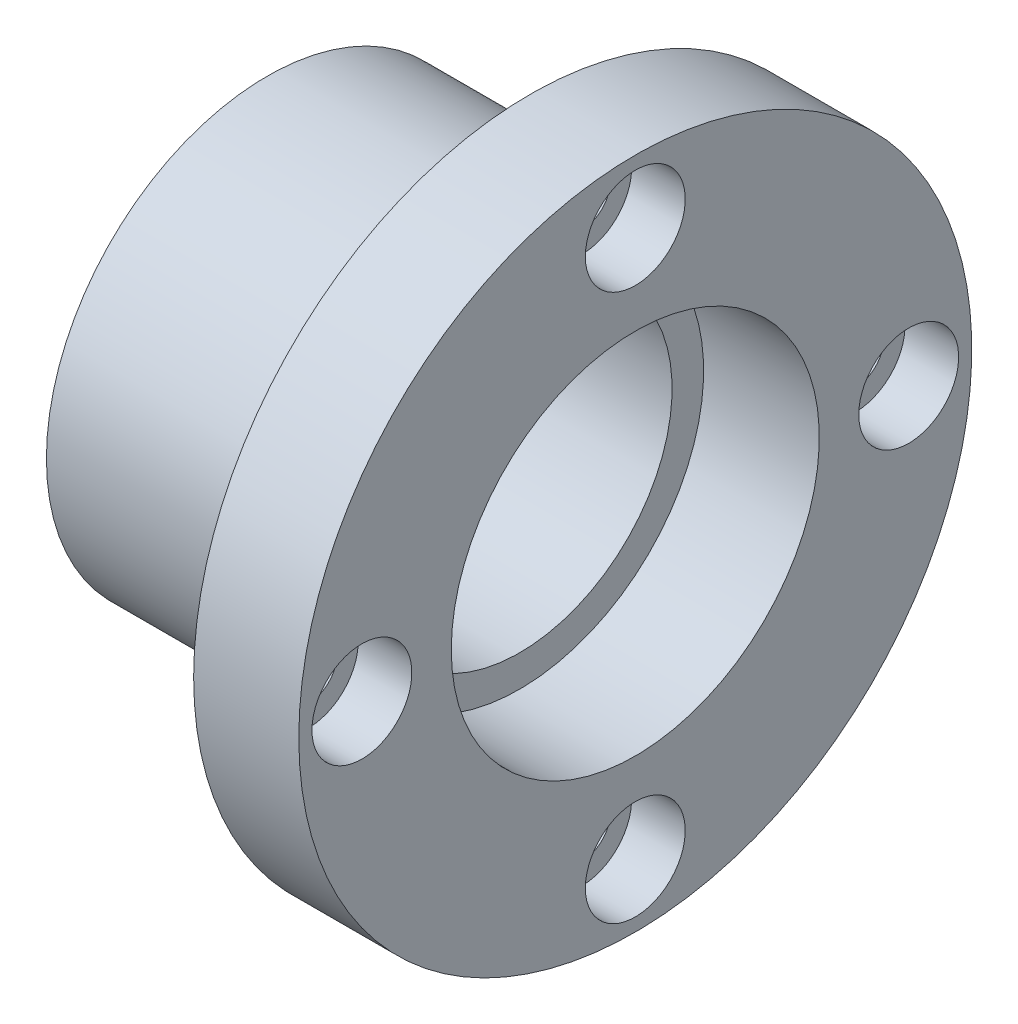
ISO-10303-21;
HEADER;
FILE_DESCRIPTION(('STEP AP214'),'2;1');
FILE_NAME('part.step','',(''),(''),'','','');
FILE_SCHEMA(('AUTOMOTIVE_DESIGN { 1 0 10303 214 1 1 1 1 }'));
ENDSEC;
DATA;
#1=APPLICATION_CONTEXT('core data for automotive mechanical design processes');
#2=APPLICATION_PROTOCOL_DEFINITION('international standard','automotive_design',2000,#1);
#3=PRODUCT_CONTEXT('',#1,'mechanical');
#4=PRODUCT('Part','Part','',(#3));
#5=PRODUCT_RELATED_PRODUCT_CATEGORY('part','',(#4));
#6=PRODUCT_DEFINITION_FORMATION('','',#4);
#7=PRODUCT_DEFINITION_CONTEXT('part definition',#1,'design');
#8=PRODUCT_DEFINITION('design','',#6,#7);
#9=PRODUCT_DEFINITION_SHAPE('','',#8);
#10=(LENGTH_UNIT() NAMED_UNIT(*) SI_UNIT(.MILLI.,.METRE.));
#11=(NAMED_UNIT(*) PLANE_ANGLE_UNIT() SI_UNIT($,.RADIAN.));
#12=(NAMED_UNIT(*) SI_UNIT($,.STERADIAN.) SOLID_ANGLE_UNIT());
#13=UNCERTAINTY_MEASURE_WITH_UNIT(LENGTH_MEASURE(1.E-05),#10,'distance_accuracy_value','');
#14=(GEOMETRIC_REPRESENTATION_CONTEXT(3) GLOBAL_UNCERTAINTY_ASSIGNED_CONTEXT((#13)) GLOBAL_UNIT_ASSIGNED_CONTEXT((#10,
#11,#12)) REPRESENTATION_CONTEXT('',''));
#15=CARTESIAN_POINT('',(0.,0.,0.));
#16=DIRECTION('',(0.,0.,1.));
#17=DIRECTION('',(1.,0.,0.));
#18=AXIS2_PLACEMENT_3D('',#15,#16,#17);
#19=CARTESIAN_POINT('',(0.,17.5,0.));
#20=DIRECTION('',(-1.,0.,0.));
#21=DIRECTION('',(0.,0.,1.));
#22=AXIS2_PLACEMENT_3D('',#19,#20,#21);
#23=PLANE('',#22);
#24=CARTESIAN_POINT('',(0.,0.,26.));
#25=DIRECTION('',(-1.,0.,0.));
#26=DIRECTION('',(0.,0.,1.));
#27=AXIS2_PLACEMENT_3D('',#24,#25,#26);
#28=CIRCLE('',#27,4.75);
#29=CARTESIAN_POINT('',(0.,0.,30.75));
#30=VERTEX_POINT('',#29);
#31=EDGE_CURVE('E108',#30,#30,#28,.T.);
#32=ORIENTED_EDGE('',*,*,#31,.T.);
#33=EDGE_LOOP('',(#32));
#34=FACE_BOUND('',#33,.T.);
#35=CARTESIAN_POINT('',(0.,26.,0.));
#36=DIRECTION('',(-1.,0.,0.));
#37=DIRECTION('',(0.,0.,1.));
#38=AXIS2_PLACEMENT_3D('',#35,#36,#37);
#39=CIRCLE('',#38,4.75);
#40=CARTESIAN_POINT('',(0.,26.,4.75));
#41=VERTEX_POINT('',#40);
#42=EDGE_CURVE('E84',#41,#41,#39,.T.);
#43=ORIENTED_EDGE('',*,*,#42,.T.);
#44=EDGE_LOOP('',(#43));
#45=FACE_BOUND('',#44,.T.);
#46=CARTESIAN_POINT('',(0.,0.,0.));
#47=DIRECTION('',(-1.,0.,0.));
#48=DIRECTION('',(0.,0.,1.));
#49=AXIS2_PLACEMENT_3D('',#46,#47,#48);
#50=CIRCLE('',#49,32.);
#51=CARTESIAN_POINT('',(0.,0.,32.));
#52=VERTEX_POINT('',#51);
#53=EDGE_CURVE('E66',#52,#52,#50,.T.);
#54=ORIENTED_EDGE('',*,*,#53,.F.);
#55=EDGE_LOOP('',(#54));
#56=FACE_BOUND('',#55,.T.);
#57=CARTESIAN_POINT('',(0.,0.,0.));
#58=DIRECTION('',(-1.,0.,0.));
#59=DIRECTION('',(0.,0.,1.));
#60=AXIS2_PLACEMENT_3D('',#57,#58,#59);
#61=CIRCLE('',#60,17.5);
#62=CARTESIAN_POINT('',(0.,0.,17.5));
#63=VERTEX_POINT('',#62);
#64=EDGE_CURVE('E63',#63,#63,#61,.T.);
#65=ORIENTED_EDGE('',*,*,#64,.T.);
#66=EDGE_LOOP('',(#65));
#67=FACE_BOUND('',#66,.T.);
#68=CARTESIAN_POINT('',(0.,0.,-26.));
#69=DIRECTION('',(-1.,0.,0.));
#70=DIRECTION('',(0.,0.,1.));
#71=AXIS2_PLACEMENT_3D('',#68,#69,#70);
#72=CIRCLE('',#71,4.75);
#73=CARTESIAN_POINT('',(0.,0.,-21.25));
#74=VERTEX_POINT('',#73);
#75=EDGE_CURVE('E96',#74,#74,#72,.T.);
#76=ORIENTED_EDGE('',*,*,#75,.T.);
#77=EDGE_LOOP('',(#76));
#78=FACE_BOUND('',#77,.T.);
#79=CARTESIAN_POINT('',(0.,-26.,0.));
#80=DIRECTION('',(-1.,0.,0.));
#81=DIRECTION('',(0.,0.,1.));
#82=AXIS2_PLACEMENT_3D('',#79,#80,#81);
#83=CIRCLE('',#82,4.75);
#84=CARTESIAN_POINT('',(0.,-26.,4.75));
#85=VERTEX_POINT('',#84);
#86=EDGE_CURVE('E120',#85,#85,#83,.T.);
#87=ORIENTED_EDGE('',*,*,#86,.T.);
#88=EDGE_LOOP('',(#87));
#89=FACE_BOUND('',#88,.T.);
#90=ADVANCED_FACE('F37',(#34,#45,#56,#67,#78,#89),#23,.F.);
#91=CARTESIAN_POINT('',(-10.,32.,0.));
#92=DIRECTION('',(1.,0.,0.));
#93=DIRECTION('',(0.,0.,-1.));
#94=AXIS2_PLACEMENT_3D('',#91,#92,#93);
#95=PLANE('',#94);
#96=CARTESIAN_POINT('',(-10.,0.,26.));
#97=DIRECTION('',(-1.,0.,0.));
#98=DIRECTION('',(0.,0.,1.));
#99=AXIS2_PLACEMENT_3D('',#96,#97,#98);
#100=CIRCLE('',#99,2.75);
#101=CARTESIAN_POINT('',(-10.,0.,28.75));
#102=VERTEX_POINT('',#101);
#103=EDGE_CURVE('E99',#102,#102,#100,.T.);
#104=ORIENTED_EDGE('',*,*,#103,.F.);
#105=EDGE_LOOP('',(#104));
#106=FACE_BOUND('',#105,.T.);
#107=CARTESIAN_POINT('',(-10.,26.,0.));
#108=DIRECTION('',(-1.,0.,0.));
#109=DIRECTION('',(0.,0.,1.));
#110=AXIS2_PLACEMENT_3D('',#107,#108,#109);
#111=CIRCLE('',#110,2.75);
#112=CARTESIAN_POINT('',(-10.,26.,2.75));
#113=VERTEX_POINT('',#112);
#114=EDGE_CURVE('E75',#113,#113,#111,.T.);
#115=ORIENTED_EDGE('',*,*,#114,.F.);
#116=EDGE_LOOP('',(#115));
#117=FACE_BOUND('',#116,.T.);
#118=CARTESIAN_POINT('',(-10.,0.,0.));
#119=DIRECTION('',(-1.,0.,0.));
#120=DIRECTION('',(0.,0.,1.));
#121=AXIS2_PLACEMENT_3D('',#118,#119,#120);
#122=CIRCLE('',#121,21.);
#123=CARTESIAN_POINT('',(-10.,0.,21.));
#124=VERTEX_POINT('',#123);
#125=EDGE_CURVE('E72',#124,#124,#122,.T.);
#126=ORIENTED_EDGE('',*,*,#125,.F.);
#127=EDGE_LOOP('',(#126));
#128=FACE_BOUND('',#127,.T.);
#129=CARTESIAN_POINT('',(-10.,0.,0.));
#130=DIRECTION('',(-1.,0.,0.));
#131=DIRECTION('',(0.,0.,1.));
#132=AXIS2_PLACEMENT_3D('',#129,#130,#131);
#133=CIRCLE('',#132,32.);
#134=CARTESIAN_POINT('',(-10.,0.,32.));
#135=VERTEX_POINT('',#134);
#136=EDGE_CURVE('E69',#135,#135,#133,.T.);
#137=ORIENTED_EDGE('',*,*,#136,.T.);
#138=EDGE_LOOP('',(#137));
#139=FACE_BOUND('',#138,.T.);
#140=CARTESIAN_POINT('',(-10.,0.,-26.));
#141=DIRECTION('',(-1.,0.,0.));
#142=DIRECTION('',(0.,0.,1.));
#143=AXIS2_PLACEMENT_3D('',#140,#141,#142);
#144=CIRCLE('',#143,2.75);
#145=CARTESIAN_POINT('',(-10.,0.,-23.25));
#146=VERTEX_POINT('',#145);
#147=EDGE_CURVE('E87',#146,#146,#144,.T.);
#148=ORIENTED_EDGE('',*,*,#147,.F.);
#149=EDGE_LOOP('',(#148));
#150=FACE_BOUND('',#149,.T.);
#151=CARTESIAN_POINT('',(-10.,-26.,0.));
#152=DIRECTION('',(-1.,0.,0.));
#153=DIRECTION('',(0.,0.,1.));
#154=AXIS2_PLACEMENT_3D('',#151,#152,#153);
#155=CIRCLE('',#154,2.75);
#156=CARTESIAN_POINT('',(-10.,-26.,2.75));
#157=VERTEX_POINT('',#156);
#158=EDGE_CURVE('E111',#157,#157,#155,.T.);
#159=ORIENTED_EDGE('',*,*,#158,.F.);
#160=EDGE_LOOP('',(#159));
#161=FACE_BOUND('',#160,.T.);
#162=ADVANCED_FACE('F137',(#106,#117,#128,#139,#150,#161),#95,.F.);
#163=CARTESIAN_POINT('',(0.,0.,0.));
#164=DIRECTION('',(-1.,0.,0.));
#165=DIRECTION('',(0.,0.,1.));
#166=AXIS2_PLACEMENT_3D('',#163,#164,#165);
#167=CYLINDRICAL_SURFACE('',#166,21.);
#168=CARTESIAN_POINT('',(-35.,0.,0.));
#169=DIRECTION('',(-1.,0.,0.));
#170=DIRECTION('',(0.,0.,1.));
#171=AXIS2_PLACEMENT_3D('',#168,#169,#170);
#172=CIRCLE('',#171,21.);
#173=CARTESIAN_POINT('',(-35.,0.,21.));
#174=VERTEX_POINT('',#173);
#175=EDGE_CURVE('E10',#174,#174,#172,.T.);
#176=ORIENTED_EDGE('',*,*,#175,.F.);
#177=EDGE_LOOP('',(#176));
#178=FACE_BOUND('',#177,.T.);
#179=ORIENTED_EDGE('',*,*,#125,.T.);
#180=EDGE_LOOP('',(#179));
#181=FACE_BOUND('',#180,.T.);
#182=ADVANCED_FACE('F39',(#178,#181),#167,.T.);
#183=CARTESIAN_POINT('',(-35.,21.,0.));
#184=DIRECTION('',(1.,0.,0.));
#185=DIRECTION('',(0.,0.,-1.));
#186=AXIS2_PLACEMENT_3D('',#183,#184,#185);
#187=PLANE('',#186);
#188=CARTESIAN_POINT('',(-35.,0.,0.));
#189=DIRECTION('',(-1.,0.,0.));
#190=DIRECTION('',(0.,0.,1.));
#191=AXIS2_PLACEMENT_3D('',#188,#189,#190);
#192=CIRCLE('',#191,17.5);
#193=CARTESIAN_POINT('',(-35.,0.,17.5));
#194=VERTEX_POINT('',#193);
#195=EDGE_CURVE('E44',#194,#194,#192,.T.);
#196=ORIENTED_EDGE('',*,*,#195,.F.);
#197=EDGE_LOOP('',(#196));
#198=FACE_BOUND('',#197,.T.);
#199=ORIENTED_EDGE('',*,*,#175,.T.);
#200=EDGE_LOOP('',(#199));
#201=FACE_BOUND('',#200,.T.);
#202=ADVANCED_FACE('F167',(#198,#201),#187,.F.);
#203=CARTESIAN_POINT('',(0.,0.,0.));
#204=DIRECTION('',(-1.,0.,0.));
#205=DIRECTION('',(0.,0.,1.));
#206=AXIS2_PLACEMENT_3D('',#203,#204,#205);
#207=CYLINDRICAL_SURFACE('',#206,17.5);
#208=CARTESIAN_POINT('',(-24.,0.,0.));
#209=DIRECTION('',(-1.,0.,0.));
#210=DIRECTION('',(0.,0.,1.));
#211=AXIS2_PLACEMENT_3D('',#208,#209,#210);
#212=CIRCLE('',#211,17.5);
#213=CARTESIAN_POINT('',(-24.,0.,17.5));
#214=VERTEX_POINT('',#213);
#215=EDGE_CURVE('E48',#214,#214,#212,.T.);
#216=ORIENTED_EDGE('',*,*,#215,.F.);
#217=EDGE_LOOP('',(#216));
#218=FACE_BOUND('',#217,.T.);
#219=ORIENTED_EDGE('',*,*,#195,.T.);
#220=EDGE_LOOP('',(#219));
#221=FACE_BOUND('',#220,.T.);
#222=ADVANCED_FACE('F164',(#218,#221),#207,.F.);
#223=CARTESIAN_POINT('',(-24.,17.5,0.));
#224=DIRECTION('',(1.,0.,0.));
#225=DIRECTION('',(0.,0.,-1.));
#226=AXIS2_PLACEMENT_3D('',#223,#224,#225);
#227=PLANE('',#226);
#228=CARTESIAN_POINT('',(-24.,0.,0.));
#229=DIRECTION('',(-1.,0.,0.));
#230=DIRECTION('',(0.,0.,1.));
#231=AXIS2_PLACEMENT_3D('',#228,#229,#230);
#232=CIRCLE('',#231,14.5);
#233=CARTESIAN_POINT('',(-24.,0.,14.5));
#234=VERTEX_POINT('',#233);
#235=EDGE_CURVE('E52',#234,#234,#232,.T.);
#236=ORIENTED_EDGE('',*,*,#235,.F.);
#237=EDGE_LOOP('',(#236));
#238=FACE_BOUND('',#237,.T.);
#239=ORIENTED_EDGE('',*,*,#215,.T.);
#240=EDGE_LOOP('',(#239));
#241=FACE_BOUND('',#240,.T.);
#242=ADVANCED_FACE('F160',(#238,#241),#227,.F.);
#243=CARTESIAN_POINT('',(0.,0.,0.));
#244=DIRECTION('',(-1.,0.,0.));
#245=DIRECTION('',(0.,0.,1.));
#246=AXIS2_PLACEMENT_3D('',#243,#244,#245);
#247=CYLINDRICAL_SURFACE('',#246,14.5);
#248=CARTESIAN_POINT('',(-11.,0.,0.));
#249=DIRECTION('',(-1.,0.,0.));
#250=DIRECTION('',(0.,0.,1.));
#251=AXIS2_PLACEMENT_3D('',#248,#249,#250);
#252=CIRCLE('',#251,14.5);
#253=CARTESIAN_POINT('',(-11.,0.,14.5));
#254=VERTEX_POINT('',#253);
#255=EDGE_CURVE('E57',#254,#254,#252,.T.);
#256=ORIENTED_EDGE('',*,*,#255,.F.);
#257=EDGE_LOOP('',(#256));
#258=FACE_BOUND('',#257,.T.);
#259=ORIENTED_EDGE('',*,*,#235,.T.);
#260=EDGE_LOOP('',(#259));
#261=FACE_BOUND('',#260,.T.);
#262=ADVANCED_FACE('F156',(#258,#261),#247,.F.);
#263=CARTESIAN_POINT('',(-11.,14.5,0.));
#264=DIRECTION('',(-1.,0.,0.));
#265=DIRECTION('',(0.,0.,1.));
#266=AXIS2_PLACEMENT_3D('',#263,#264,#265);
#267=PLANE('',#266);
#268=CARTESIAN_POINT('',(-11.,0.,0.));
#269=DIRECTION('',(-1.,0.,0.));
#270=DIRECTION('',(0.,0.,1.));
#271=AXIS2_PLACEMENT_3D('',#268,#269,#270);
#272=CIRCLE('',#271,17.5);
#273=CARTESIAN_POINT('',(-11.,0.,17.5));
#274=VERTEX_POINT('',#273);
#275=EDGE_CURVE('E60',#274,#274,#272,.T.);
#276=ORIENTED_EDGE('',*,*,#275,.F.);
#277=EDGE_LOOP('',(#276));
#278=FACE_BOUND('',#277,.T.);
#279=ORIENTED_EDGE('',*,*,#255,.T.);
#280=EDGE_LOOP('',(#279));
#281=FACE_BOUND('',#280,.T.);
#282=ADVANCED_FACE('F152',(#278,#281),#267,.F.);
#283=CARTESIAN_POINT('',(0.,0.,0.));
#284=DIRECTION('',(-1.,0.,0.));
#285=DIRECTION('',(0.,0.,1.));
#286=AXIS2_PLACEMENT_3D('',#283,#284,#285);
#287=CYLINDRICAL_SURFACE('',#286,17.5);
#288=ORIENTED_EDGE('',*,*,#64,.F.);
#289=EDGE_LOOP('',(#288));
#290=FACE_BOUND('',#289,.T.);
#291=ORIENTED_EDGE('',*,*,#275,.T.);
#292=EDGE_LOOP('',(#291));
#293=FACE_BOUND('',#292,.T.);
#294=ADVANCED_FACE('F149',(#290,#293),#287,.F.);
#295=CARTESIAN_POINT('',(0.,0.,0.));
#296=DIRECTION('',(-1.,0.,0.));
#297=DIRECTION('',(0.,0.,1.));
#298=AXIS2_PLACEMENT_3D('',#295,#296,#297);
#299=CYLINDRICAL_SURFACE('',#298,32.);
#300=ORIENTED_EDGE('',*,*,#136,.F.);
#301=EDGE_LOOP('',(#300));
#302=FACE_BOUND('',#301,.T.);
#303=ORIENTED_EDGE('',*,*,#53,.T.);
#304=EDGE_LOOP('',(#303));
#305=FACE_BOUND('',#304,.T.);
#306=ADVANCED_FACE('F148',(#302,#305),#299,.T.);
#307=CARTESIAN_POINT('',(0.,26.,0.));
#308=DIRECTION('',(-1.,0.,0.));
#309=DIRECTION('',(0.,0.,1.));
#310=AXIS2_PLACEMENT_3D('',#307,#308,#309);
#311=CYLINDRICAL_SURFACE('',#310,2.75);
#312=ORIENTED_EDGE('',*,*,#114,.T.);
#313=EDGE_LOOP('',(#312));
#314=FACE_BOUND('',#313,.T.);
#315=CARTESIAN_POINT('',(-5.1,26.,0.));
#316=DIRECTION('',(-1.,0.,0.));
#317=DIRECTION('',(0.,0.,1.));
#318=AXIS2_PLACEMENT_3D('',#315,#316,#317);
#319=CIRCLE('',#318,2.75);
#320=CARTESIAN_POINT('',(-5.1,26.,2.75));
#321=VERTEX_POINT('',#320);
#322=EDGE_CURVE('E78',#321,#321,#319,.T.);
#323=ORIENTED_EDGE('',*,*,#322,.F.);
#324=EDGE_LOOP('',(#323));
#325=FACE_BOUND('',#324,.T.);
#326=ADVANCED_FACE('F227',(#314,#325),#311,.F.);
#327=CARTESIAN_POINT('',(-5.1,28.75,0.));
#328=DIRECTION('',(1.,0.,0.));
#329=DIRECTION('',(0.,0.,-1.));
#330=AXIS2_PLACEMENT_3D('',#327,#328,#329);
#331=PLANE('',#330);
#332=ORIENTED_EDGE('',*,*,#322,.T.);
#333=EDGE_LOOP('',(#332));
#334=FACE_BOUND('',#333,.T.);
#335=CARTESIAN_POINT('',(-5.1,26.,0.));
#336=DIRECTION('',(-1.,0.,0.));
#337=DIRECTION('',(0.,0.,1.));
#338=AXIS2_PLACEMENT_3D('',#335,#336,#337);
#339=CIRCLE('',#338,4.75);
#340=CARTESIAN_POINT('',(-5.1,26.,4.75));
#341=VERTEX_POINT('',#340);
#342=EDGE_CURVE('E81',#341,#341,#339,.T.);
#343=ORIENTED_EDGE('',*,*,#342,.F.);
#344=EDGE_LOOP('',(#343));
#345=FACE_BOUND('',#344,.T.);
#346=ADVANCED_FACE('F223',(#334,#345),#331,.T.);
#347=CARTESIAN_POINT('',(0.,26.,0.));
#348=DIRECTION('',(-1.,0.,0.));
#349=DIRECTION('',(0.,0.,1.));
#350=AXIS2_PLACEMENT_3D('',#347,#348,#349);
#351=CYLINDRICAL_SURFACE('',#350,4.75);
#352=ORIENTED_EDGE('',*,*,#342,.T.);
#353=EDGE_LOOP('',(#352));
#354=FACE_BOUND('',#353,.T.);
#355=ORIENTED_EDGE('',*,*,#42,.F.);
#356=EDGE_LOOP('',(#355));
#357=FACE_BOUND('',#356,.T.);
#358=ADVANCED_FACE('F219',(#354,#357),#351,.F.);
#359=CARTESIAN_POINT('',(0.,0.,-26.));
#360=DIRECTION('',(-1.,0.,0.));
#361=DIRECTION('',(0.,0.,1.));
#362=AXIS2_PLACEMENT_3D('',#359,#360,#361);
#363=CYLINDRICAL_SURFACE('',#362,2.75);
#364=ORIENTED_EDGE('',*,*,#147,.T.);
#365=EDGE_LOOP('',(#364));
#366=FACE_BOUND('',#365,.T.);
#367=CARTESIAN_POINT('',(-5.1,0.,-26.));
#368=DIRECTION('',(-1.,0.,0.));
#369=DIRECTION('',(0.,0.,1.));
#370=AXIS2_PLACEMENT_3D('',#367,#368,#369);
#371=CIRCLE('',#370,2.75);
#372=CARTESIAN_POINT('',(-5.1,0.,-23.25));
#373=VERTEX_POINT('',#372);
#374=EDGE_CURVE('E90',#373,#373,#371,.T.);
#375=ORIENTED_EDGE('',*,*,#374,.F.);
#376=EDGE_LOOP('',(#375));
#377=FACE_BOUND('',#376,.T.);
#378=ADVANCED_FACE('F215',(#366,#377),#363,.F.);
#379=CARTESIAN_POINT('',(-5.1,2.74999999999998,-26.));
#380=DIRECTION('',(1.,0.,0.));
#381=DIRECTION('',(0.,0.,-1.));
#382=AXIS2_PLACEMENT_3D('',#379,#380,#381);
#383=PLANE('',#382);
#384=ORIENTED_EDGE('',*,*,#374,.T.);
#385=EDGE_LOOP('',(#384));
#386=FACE_BOUND('',#385,.T.);
#387=CARTESIAN_POINT('',(-5.1,0.,-26.));
#388=DIRECTION('',(-1.,0.,0.));
#389=DIRECTION('',(0.,0.,1.));
#390=AXIS2_PLACEMENT_3D('',#387,#388,#389);
#391=CIRCLE('',#390,4.75);
#392=CARTESIAN_POINT('',(-5.1,0.,-21.25));
#393=VERTEX_POINT('',#392);
#394=EDGE_CURVE('E93',#393,#393,#391,.T.);
#395=ORIENTED_EDGE('',*,*,#394,.F.);
#396=EDGE_LOOP('',(#395));
#397=FACE_BOUND('',#396,.T.);
#398=ADVANCED_FACE('F211',(#386,#397),#383,.T.);
#399=CARTESIAN_POINT('',(0.,0.,-26.));
#400=DIRECTION('',(-1.,0.,0.));
#401=DIRECTION('',(0.,0.,1.));
#402=AXIS2_PLACEMENT_3D('',#399,#400,#401);
#403=CYLINDRICAL_SURFACE('',#402,4.75);
#404=ORIENTED_EDGE('',*,*,#394,.T.);
#405=EDGE_LOOP('',(#404));
#406=FACE_BOUND('',#405,.T.);
#407=ORIENTED_EDGE('',*,*,#75,.F.);
#408=EDGE_LOOP('',(#407));
#409=FACE_BOUND('',#408,.T.);
#410=ADVANCED_FACE('F207',(#406,#409),#403,.F.);
#411=CARTESIAN_POINT('',(0.,0.,26.));
#412=DIRECTION('',(-1.,0.,0.));
#413=DIRECTION('',(0.,0.,1.));
#414=AXIS2_PLACEMENT_3D('',#411,#412,#413);
#415=CYLINDRICAL_SURFACE('',#414,2.75);
#416=ORIENTED_EDGE('',*,*,#103,.T.);
#417=EDGE_LOOP('',(#416));
#418=FACE_BOUND('',#417,.T.);
#419=CARTESIAN_POINT('',(-5.1,0.,26.));
#420=DIRECTION('',(-1.,0.,0.));
#421=DIRECTION('',(0.,0.,1.));
#422=AXIS2_PLACEMENT_3D('',#419,#420,#421);
#423=CIRCLE('',#422,2.75);
#424=CARTESIAN_POINT('',(-5.1,0.,28.75));
#425=VERTEX_POINT('',#424);
#426=EDGE_CURVE('E102',#425,#425,#423,.T.);
#427=ORIENTED_EDGE('',*,*,#426,.F.);
#428=EDGE_LOOP('',(#427));
#429=FACE_BOUND('',#428,.T.);
#430=ADVANCED_FACE('F203',(#418,#429),#415,.F.);
#431=CARTESIAN_POINT('',(-5.1,2.75000000000001,26.));
#432=DIRECTION('',(1.,0.,0.));
#433=DIRECTION('',(0.,0.,-1.));
#434=AXIS2_PLACEMENT_3D('',#431,#432,#433);
#435=PLANE('',#434);
#436=ORIENTED_EDGE('',*,*,#426,.T.);
#437=EDGE_LOOP('',(#436));
#438=FACE_BOUND('',#437,.T.);
#439=CARTESIAN_POINT('',(-5.1,0.,26.));
#440=DIRECTION('',(-1.,0.,0.));
#441=DIRECTION('',(0.,0.,1.));
#442=AXIS2_PLACEMENT_3D('',#439,#440,#441);
#443=CIRCLE('',#442,4.75);
#444=CARTESIAN_POINT('',(-5.1,0.,30.75));
#445=VERTEX_POINT('',#444);
#446=EDGE_CURVE('E105',#445,#445,#443,.T.);
#447=ORIENTED_EDGE('',*,*,#446,.F.);
#448=EDGE_LOOP('',(#447));
#449=FACE_BOUND('',#448,.T.);
#450=ADVANCED_FACE('F197',(#438,#449),#435,.T.);
#451=CARTESIAN_POINT('',(0.,0.,26.));
#452=DIRECTION('',(-1.,0.,0.));
#453=DIRECTION('',(0.,0.,1.));
#454=AXIS2_PLACEMENT_3D('',#451,#452,#453);
#455=CYLINDRICAL_SURFACE('',#454,4.75);
#456=ORIENTED_EDGE('',*,*,#446,.T.);
#457=EDGE_LOOP('',(#456));
#458=FACE_BOUND('',#457,.T.);
#459=ORIENTED_EDGE('',*,*,#31,.F.);
#460=EDGE_LOOP('',(#459));
#461=FACE_BOUND('',#460,.T.);
#462=ADVANCED_FACE('F189',(#458,#461),#455,.F.);
#463=CARTESIAN_POINT('',(0.,-26.,0.));
#464=DIRECTION('',(-1.,0.,0.));
#465=DIRECTION('',(0.,0.,1.));
#466=AXIS2_PLACEMENT_3D('',#463,#464,#465);
#467=CYLINDRICAL_SURFACE('',#466,2.75);
#468=ORIENTED_EDGE('',*,*,#158,.T.);
#469=EDGE_LOOP('',(#468));
#470=FACE_BOUND('',#469,.T.);
#471=CARTESIAN_POINT('',(-5.1,-26.,0.));
#472=DIRECTION('',(-1.,0.,0.));
#473=DIRECTION('',(0.,0.,1.));
#474=AXIS2_PLACEMENT_3D('',#471,#472,#473);
#475=CIRCLE('',#474,2.75);
#476=CARTESIAN_POINT('',(-5.1,-26.,2.75));
#477=VERTEX_POINT('',#476);
#478=EDGE_CURVE('E114',#477,#477,#475,.T.);
#479=ORIENTED_EDGE('',*,*,#478,.F.);
#480=EDGE_LOOP('',(#479));
#481=FACE_BOUND('',#480,.T.);
#482=ADVANCED_FACE('F133',(#470,#481),#467,.F.);
#483=CARTESIAN_POINT('',(-5.1,-23.25,0.));
#484=DIRECTION('',(1.,0.,0.));
#485=DIRECTION('',(0.,0.,-1.));
#486=AXIS2_PLACEMENT_3D('',#483,#484,#485);
#487=PLANE('',#486);
#488=ORIENTED_EDGE('',*,*,#478,.T.);
#489=EDGE_LOOP('',(#488));
#490=FACE_BOUND('',#489,.T.);
#491=CARTESIAN_POINT('',(-5.1,-26.,0.));
#492=DIRECTION('',(-1.,0.,0.));
#493=DIRECTION('',(0.,0.,1.));
#494=AXIS2_PLACEMENT_3D('',#491,#492,#493);
#495=CIRCLE('',#494,4.75);
#496=CARTESIAN_POINT('',(-5.1,-26.,4.75));
#497=VERTEX_POINT('',#496);
#498=EDGE_CURVE('E117',#497,#497,#495,.T.);
#499=ORIENTED_EDGE('',*,*,#498,.F.);
#500=EDGE_LOOP('',(#499));
#501=FACE_BOUND('',#500,.T.);
#502=ADVANCED_FACE('F127',(#490,#501),#487,.T.);
#503=CARTESIAN_POINT('',(0.,-26.,0.));
#504=DIRECTION('',(-1.,0.,0.));
#505=DIRECTION('',(0.,0.,1.));
#506=AXIS2_PLACEMENT_3D('',#503,#504,#505);
#507=CYLINDRICAL_SURFACE('',#506,4.75);
#508=ORIENTED_EDGE('',*,*,#498,.T.);
#509=EDGE_LOOP('',(#508));
#510=FACE_BOUND('',#509,.T.);
#511=ORIENTED_EDGE('',*,*,#86,.F.);
#512=EDGE_LOOP('',(#511));
#513=FACE_BOUND('',#512,.T.);
#514=ADVANCED_FACE('F125',(#510,#513),#507,.F.);
#515=CLOSED_SHELL('',(#90,#162,#182,#202,#222,#242,#262,#282,#294,#306,#326,#346,#358,#378,#398,
#410,#430,#450,#462,#482,#502,#514));
#516=MANIFOLD_SOLID_BREP('B2',#515);
#517=ADVANCED_BREP_SHAPE_REPRESENTATION('',(#18,#516),#14);
#518=SHAPE_DEFINITION_REPRESENTATION(#9,#517);
ENDSEC;
END-ISO-10303-21;
